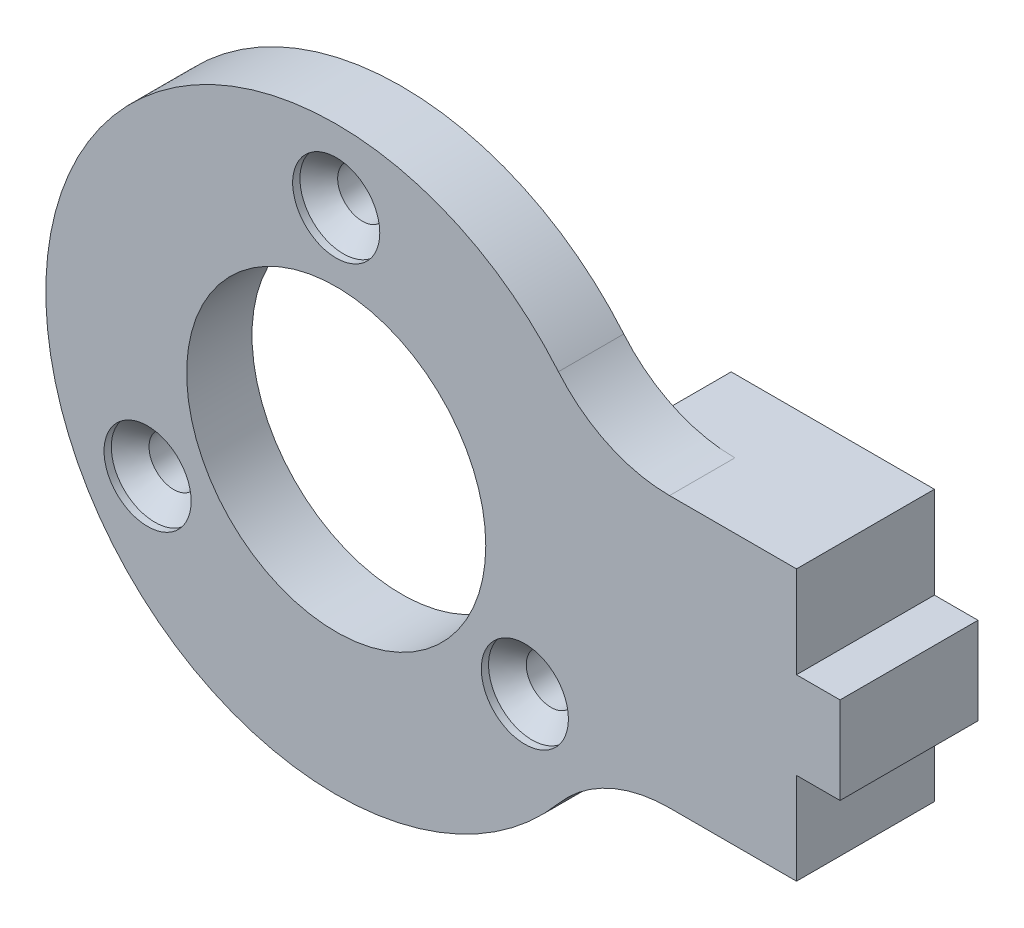
ISO-10303-21;
HEADER;
FILE_DESCRIPTION(('STEP AP214'),'2;1');
FILE_NAME('part.step','',(''),(''),'','','');
FILE_SCHEMA(('AUTOMOTIVE_DESIGN { 1 0 10303 214 1 1 1 1 }'));
ENDSEC;
DATA;
#1=APPLICATION_CONTEXT('core data for automotive mechanical design processes');
#2=APPLICATION_PROTOCOL_DEFINITION('international standard','automotive_design',2000,#1);
#3=PRODUCT_CONTEXT('',#1,'mechanical');
#4=PRODUCT('Part','Part','',(#3));
#5=PRODUCT_RELATED_PRODUCT_CATEGORY('part','',(#4));
#6=PRODUCT_DEFINITION_FORMATION('','',#4);
#7=PRODUCT_DEFINITION_CONTEXT('part definition',#1,'design');
#8=PRODUCT_DEFINITION('design','',#6,#7);
#9=PRODUCT_DEFINITION_SHAPE('','',#8);
#10=(LENGTH_UNIT() NAMED_UNIT(*) SI_UNIT(.MILLI.,.METRE.));
#11=(NAMED_UNIT(*) PLANE_ANGLE_UNIT() SI_UNIT($,.RADIAN.));
#12=(NAMED_UNIT(*) SI_UNIT($,.STERADIAN.) SOLID_ANGLE_UNIT());
#13=UNCERTAINTY_MEASURE_WITH_UNIT(LENGTH_MEASURE(1.E-05),#10,'distance_accuracy_value','');
#14=(GEOMETRIC_REPRESENTATION_CONTEXT(3) GLOBAL_UNCERTAINTY_ASSIGNED_CONTEXT((#13)) GLOBAL_UNIT_ASSIGNED_CONTEXT((#10,
#11,#12)) REPRESENTATION_CONTEXT('',''));
#15=CARTESIAN_POINT('',(0.,0.,0.));
#16=DIRECTION('',(0.,0.,1.));
#17=DIRECTION('',(1.,0.,0.));
#18=AXIS2_PLACEMENT_3D('',#15,#16,#17);
#19=CARTESIAN_POINT('',(0.,0.,0.));
#20=DIRECTION('',(0.,0.,1.));
#21=DIRECTION('',(1.,0.,0.));
#22=AXIS2_PLACEMENT_3D('',#19,#20,#21);
#23=PLANE('',#22);
#24=CARTESIAN_POINT('',(-12.9903810567665,-7.50000000000006,0.));
#25=DIRECTION('',(0.,0.,1.));
#26=DIRECTION('',(1.,0.,0.));
#27=AXIS2_PLACEMENT_3D('',#24,#25,#26);
#28=CIRCLE('',#27,1.7);
#29=CARTESIAN_POINT('',(-11.2903810567665,-7.50000000000006,0.));
#30=VERTEX_POINT('',#29);
#31=EDGE_CURVE('E186',#30,#30,#28,.T.);
#32=ORIENTED_EDGE('',*,*,#31,.T.);
#33=EDGE_LOOP('',(#32));
#34=FACE_BOUND('',#33,.T.);
#35=CARTESIAN_POINT('',(0.,15.,0.));
#36=DIRECTION('',(0.,0.,1.));
#37=DIRECTION('',(1.,0.,0.));
#38=AXIS2_PLACEMENT_3D('',#35,#36,#37);
#39=CIRCLE('',#38,1.7);
#40=CARTESIAN_POINT('',(1.7,15.,0.));
#41=VERTEX_POINT('',#40);
#42=EDGE_CURVE('E194',#41,#41,#39,.T.);
#43=ORIENTED_EDGE('',*,*,#42,.T.);
#44=EDGE_LOOP('',(#43));
#45=FACE_BOUND('',#44,.T.);
#46=CARTESIAN_POINT('',(12.9903810567666,-7.49999999999988,0.));
#47=DIRECTION('',(0.,0.,1.));
#48=DIRECTION('',(1.,0.,0.));
#49=AXIS2_PLACEMENT_3D('',#46,#47,#48);
#50=CIRCLE('',#49,1.7);
#51=CARTESIAN_POINT('',(14.6903810567666,-7.49999999999988,0.));
#52=VERTEX_POINT('',#51);
#53=EDGE_CURVE('E197',#52,#52,#50,.T.);
#54=ORIENTED_EDGE('',*,*,#53,.T.);
#55=EDGE_LOOP('',(#54));
#56=FACE_BOUND('',#55,.T.);
#57=CARTESIAN_POINT('',(0.,0.,0.));
#58=DIRECTION('',(0.,0.,1.));
#59=DIRECTION('',(1.,0.,0.));
#60=AXIS2_PLACEMENT_3D('',#57,#58,#59);
#61=CIRCLE('',#60,10.3);
#62=CARTESIAN_POINT('',(10.3,0.,0.));
#63=VERTEX_POINT('',#62);
#64=EDGE_CURVE('E200',#63,#63,#61,.T.);
#65=ORIENTED_EDGE('',*,*,#64,.T.);
#66=EDGE_LOOP('',(#65));
#67=FACE_BOUND('',#66,.T.);
#68=CARTESIAN_POINT('',(0.,0.,0.));
#69=DIRECTION('',(0.,0.,1.));
#70=DIRECTION('',(1.,0.,0.));
#71=AXIS2_PLACEMENT_3D('',#68,#69,#70);
#72=CIRCLE('',#71,20.);
#73=CARTESIAN_POINT('',(15.3033552020235,12.876619104435,0.));
#74=VERTEX_POINT('',#73);
#75=CARTESIAN_POINT('',(15.3033552020235,-12.876619104435,0.));
#76=VERTEX_POINT('',#75);
#77=EDGE_CURVE('E204',#74,#76,#72,.T.);
#78=ORIENTED_EDGE('',*,*,#77,.F.);
#79=CARTESIAN_POINT('',(22.9550328030353,19.3149286566524,0.));
#80=DIRECTION('',(0.,0.,1.));
#81=DIRECTION('',(1.,0.,0.));
#82=AXIS2_PLACEMENT_3D('',#79,#80,#81);
#83=CIRCLE('',#82,10.);
#84=CARTESIAN_POINT('',(22.9550328030353,9.31492865665245,0.));
#85=VERTEX_POINT('',#84);
#86=EDGE_CURVE('E41',#74,#85,#83,.T.);
#87=ORIENTED_EDGE('',*,*,#86,.T.);
#88=DIRECTION('',(1.,0.,0.));
#89=VECTOR('',#88,1.);
#90=CARTESIAN_POINT('',(0.,9.31492865665244,0.));
#91=LINE('',#90,#89);
#92=CARTESIAN_POINT('',(17.6983644476396,9.31492865665245,0.));
#93=VERTEX_POINT('',#92);
#94=EDGE_CURVE('E48',#93,#85,#91,.T.);
#95=ORIENTED_EDGE('',*,*,#94,.F.);
#96=CARTESIAN_POINT('',(0.,0.,0.));
#97=DIRECTION('',(0.,0.,-1.));
#98=DIRECTION('',(-1.,0.,0.));
#99=AXIS2_PLACEMENT_3D('',#96,#97,#98);
#100=CIRCLE('',#99,20.);
#101=CARTESIAN_POINT('',(17.6983644476396,-9.31492865665245,0.));
#102=VERTEX_POINT('',#101);
#103=EDGE_CURVE('E133',#93,#102,#100,.T.);
#104=ORIENTED_EDGE('',*,*,#103,.T.);
#105=DIRECTION('',(-1.,0.,0.));
#106=VECTOR('',#105,1.);
#107=CARTESIAN_POINT('',(0.,-9.31492865665244,0.));
#108=LINE('',#107,#106);
#109=CARTESIAN_POINT('',(22.9550328030353,-9.31492865665245,0.));
#110=VERTEX_POINT('',#109);
#111=EDGE_CURVE('E120',#110,#102,#108,.T.);
#112=ORIENTED_EDGE('',*,*,#111,.F.);
#113=CARTESIAN_POINT('',(22.9550328030353,-19.3149286566524,0.));
#114=DIRECTION('',(0.,0.,1.));
#115=DIRECTION('',(1.,0.,0.));
#116=AXIS2_PLACEMENT_3D('',#113,#114,#115);
#117=CIRCLE('',#116,10.);
#118=EDGE_CURVE('E251',#110,#76,#117,.T.);
#119=ORIENTED_EDGE('',*,*,#118,.T.);
#120=EDGE_LOOP('',(#78,#87,#95,#104,#112,#119));
#121=FACE_BOUND('',#120,.T.);
#122=ADVANCED_FACE('F33',(#34,#45,#56,#67,#121),#23,.F.);
#123=CARTESIAN_POINT('',(31.6983644476396,9.31492865665245,4.5));
#124=DIRECTION('',(-1.,0.,0.));
#125=DIRECTION('',(0.,0.,1.));
#126=AXIS2_PLACEMENT_3D('',#123,#124,#125);
#127=PLANE('',#126);
#128=DIRECTION('',(0.,0.,-1.));
#129=VECTOR('',#128,1.);
#130=CARTESIAN_POINT('',(31.6983644476396,-3.,0.));
#131=LINE('',#130,#129);
#132=CARTESIAN_POINT('',(31.6983644476396,-3.,4.5));
#133=VERTEX_POINT('',#132);
#134=CARTESIAN_POINT('',(31.6983644476396,-3.,-5.));
#135=VERTEX_POINT('',#134);
#136=EDGE_CURVE('E163',#133,#135,#131,.T.);
#137=ORIENTED_EDGE('',*,*,#136,.F.);
#138=DIRECTION('',(0.,1.,0.));
#139=VECTOR('',#138,1.);
#140=CARTESIAN_POINT('',(31.6983644476396,9.31492865665245,4.5));
#141=LINE('',#140,#139);
#142=CARTESIAN_POINT('',(31.6983644476396,-9.31492865665245,4.5));
#143=VERTEX_POINT('',#142);
#144=EDGE_CURVE('E213',#143,#133,#141,.T.);
#145=ORIENTED_EDGE('',*,*,#144,.F.);
#146=DIRECTION('',(0.,0.,-1.));
#147=VECTOR('',#146,1.);
#148=CARTESIAN_POINT('',(31.6983644476396,-9.31492865665245,4.5));
#149=LINE('',#148,#147);
#150=CARTESIAN_POINT('',(31.6983644476396,-9.31492865665245,-5.));
#151=VERTEX_POINT('',#150);
#152=EDGE_CURVE('E223',#143,#151,#149,.T.);
#153=ORIENTED_EDGE('',*,*,#152,.T.);
#154=DIRECTION('',(0.,-1.,0.));
#155=VECTOR('',#154,1.);
#156=CARTESIAN_POINT('',(31.6983644476396,-9.31492865665245,-5.));
#157=LINE('',#156,#155);
#158=EDGE_CURVE('E158',#135,#151,#157,.T.);
#159=ORIENTED_EDGE('',*,*,#158,.F.);
#160=EDGE_LOOP('',(#137,#145,#153,#159));
#161=FACE_BOUND('',#160,.T.);
#162=ADVANCED_FACE('F284',(#161),#127,.F.);
#163=DIRECTION('',(0.,0.,1.));
#164=VECTOR('',#163,1.);
#165=CARTESIAN_POINT('',(31.6983644476396,3.,4.5));
#166=LINE('',#165,#164);
#167=CARTESIAN_POINT('',(31.6983644476396,3.,-5.));
#168=VERTEX_POINT('',#167);
#169=CARTESIAN_POINT('',(31.6983644476396,3.,4.5));
#170=VERTEX_POINT('',#169);
#171=EDGE_CURVE('E168',#168,#170,#166,.T.);
#172=ORIENTED_EDGE('',*,*,#171,.F.);
#173=DIRECTION('',(0.,-1.,0.));
#174=VECTOR('',#173,1.);
#175=CARTESIAN_POINT('',(31.6983644476396,3.,-5.));
#176=LINE('',#175,#174);
#177=CARTESIAN_POINT('',(31.6983644476396,9.31492865665245,-5.));
#178=VERTEX_POINT('',#177);
#179=EDGE_CURVE('E143',#178,#168,#176,.T.);
#180=ORIENTED_EDGE('',*,*,#179,.F.);
#181=DIRECTION('',(0.,0.,-1.));
#182=VECTOR('',#181,1.);
#183=CARTESIAN_POINT('',(31.6983644476396,9.31492865665245,4.5));
#184=LINE('',#183,#182);
#185=CARTESIAN_POINT('',(31.6983644476396,9.31492865665245,4.5));
#186=VERTEX_POINT('',#185);
#187=EDGE_CURVE('E219',#186,#178,#184,.T.);
#188=ORIENTED_EDGE('',*,*,#187,.F.);
#189=EDGE_CURVE('E212',#170,#186,#141,.T.);
#190=ORIENTED_EDGE('',*,*,#189,.F.);
#191=EDGE_LOOP('',(#172,#180,#188,#190));
#192=FACE_BOUND('',#191,.T.);
#193=ADVANCED_FACE('F276',(#192),#127,.F.);
#194=CARTESIAN_POINT('',(12.9903810567666,-7.49999999999988,4.5));
#195=DIRECTION('',(0.,0.,-1.));
#196=DIRECTION('',(-1.,0.,0.));
#197=AXIS2_PLACEMENT_3D('',#194,#195,#196);
#198=CYLINDRICAL_SURFACE('',#197,1.7);
#199=CARTESIAN_POINT('',(12.9903810567666,-7.49999999999988,2.70000000000002));
#200=DIRECTION('',(0.,0.,1.));
#201=DIRECTION('',(1.,0.,0.));
#202=AXIS2_PLACEMENT_3D('',#199,#200,#201);
#203=CIRCLE('',#202,1.7);
#204=CARTESIAN_POINT('',(14.6903810567666,-7.49999999999988,2.70000000000002));
#205=VERTEX_POINT('',#204);
#206=EDGE_CURVE('E234',#205,#205,#203,.T.);
#207=ORIENTED_EDGE('',*,*,#206,.T.);
#208=EDGE_LOOP('',(#207));
#209=FACE_BOUND('',#208,.T.);
#210=ORIENTED_EDGE('',*,*,#53,.F.);
#211=EDGE_LOOP('',(#210));
#212=FACE_BOUND('',#211,.T.);
#213=ADVANCED_FACE('F370',(#209,#212),#198,.F.);
#214=CARTESIAN_POINT('',(0.,15.,4.5));
#215=DIRECTION('',(0.,0.,-1.));
#216=DIRECTION('',(-1.,0.,0.));
#217=AXIS2_PLACEMENT_3D('',#214,#215,#216);
#218=CYLINDRICAL_SURFACE('',#217,1.7);
#219=CARTESIAN_POINT('',(0.,15.,2.70000000000002));
#220=DIRECTION('',(0.,0.,1.));
#221=DIRECTION('',(1.,0.,0.));
#222=AXIS2_PLACEMENT_3D('',#219,#220,#221);
#223=CIRCLE('',#222,1.7);
#224=CARTESIAN_POINT('',(1.7,15.,2.70000000000002));
#225=VERTEX_POINT('',#224);
#226=EDGE_CURVE('E237',#225,#225,#223,.T.);
#227=ORIENTED_EDGE('',*,*,#226,.T.);
#228=EDGE_LOOP('',(#227));
#229=FACE_BOUND('',#228,.T.);
#230=ORIENTED_EDGE('',*,*,#42,.F.);
#231=EDGE_LOOP('',(#230));
#232=FACE_BOUND('',#231,.T.);
#233=ADVANCED_FACE('F439',(#229,#232),#218,.F.);
#234=CARTESIAN_POINT('',(-12.9903810567665,-7.50000000000006,4.5));
#235=DIRECTION('',(0.,0.,-1.));
#236=DIRECTION('',(-1.,0.,0.));
#237=AXIS2_PLACEMENT_3D('',#234,#235,#236);
#238=CYLINDRICAL_SURFACE('',#237,1.7);
#239=CARTESIAN_POINT('',(-12.9903810567665,-7.50000000000006,2.70000000000002));
#240=DIRECTION('',(0.,0.,1.));
#241=DIRECTION('',(1.,0.,0.));
#242=AXIS2_PLACEMENT_3D('',#239,#240,#241);
#243=CIRCLE('',#242,1.7);
#244=CARTESIAN_POINT('',(-11.2903810567665,-7.50000000000006,2.70000000000002));
#245=VERTEX_POINT('',#244);
#246=EDGE_CURVE('E128',#245,#245,#243,.T.);
#247=ORIENTED_EDGE('',*,*,#246,.T.);
#248=EDGE_LOOP('',(#247));
#249=FACE_BOUND('',#248,.T.);
#250=ORIENTED_EDGE('',*,*,#31,.F.);
#251=EDGE_LOOP('',(#250));
#252=FACE_BOUND('',#251,.T.);
#253=ADVANCED_FACE('F434',(#249,#252),#238,.F.);
#254=CARTESIAN_POINT('',(0.,0.,4.5));
#255=DIRECTION('',(0.,0.,1.));
#256=DIRECTION('',(1.,0.,0.));
#257=AXIS2_PLACEMENT_3D('',#254,#255,#256);
#258=PLANE('',#257);
#259=CARTESIAN_POINT('',(0.,15.,4.5));
#260=DIRECTION('',(0.,0.,1.));
#261=DIRECTION('',(1.,0.,0.));
#262=AXIS2_PLACEMENT_3D('',#259,#260,#261);
#263=CIRCLE('',#262,3.);
#264=CARTESIAN_POINT('',(3.,15.,4.5));
#265=VERTEX_POINT('',#264);
#266=EDGE_CURVE('E183',#265,#265,#263,.T.);
#267=ORIENTED_EDGE('',*,*,#266,.F.);
#268=EDGE_LOOP('',(#267));
#269=FACE_BOUND('',#268,.T.);
#270=CARTESIAN_POINT('',(12.9903810567666,-7.49999999999988,4.5));
#271=DIRECTION('',(0.,0.,1.));
#272=DIRECTION('',(1.,0.,0.));
#273=AXIS2_PLACEMENT_3D('',#270,#271,#272);
#274=CIRCLE('',#273,3.);
#275=CARTESIAN_POINT('',(15.9903810567667,-7.49999999999988,4.5));
#276=VERTEX_POINT('',#275);
#277=EDGE_CURVE('E187',#276,#276,#274,.T.);
#278=ORIENTED_EDGE('',*,*,#277,.F.);
#279=EDGE_LOOP('',(#278));
#280=FACE_BOUND('',#279,.T.);
#281=CARTESIAN_POINT('',(-12.9903810567665,-7.50000000000006,4.5));
#282=DIRECTION('',(0.,0.,1.));
#283=DIRECTION('',(1.,0.,0.));
#284=AXIS2_PLACEMENT_3D('',#281,#282,#283);
#285=CIRCLE('',#284,3.);
#286=CARTESIAN_POINT('',(-9.99038105676654,-7.50000000000006,4.5));
#287=VERTEX_POINT('',#286);
#288=EDGE_CURVE('E182',#287,#287,#285,.T.);
#289=ORIENTED_EDGE('',*,*,#288,.F.);
#290=EDGE_LOOP('',(#289));
#291=FACE_BOUND('',#290,.T.);
#292=CARTESIAN_POINT('',(0.,0.,4.5));
#293=DIRECTION('',(0.,0.,1.));
#294=DIRECTION('',(1.,0.,0.));
#295=AXIS2_PLACEMENT_3D('',#292,#293,#294);
#296=CIRCLE('',#295,10.3);
#297=CARTESIAN_POINT('',(10.3,0.,4.5));
#298=VERTEX_POINT('',#297);
#299=EDGE_CURVE('E201',#298,#298,#296,.T.);
#300=ORIENTED_EDGE('',*,*,#299,.F.);
#301=EDGE_LOOP('',(#300));
#302=FACE_BOUND('',#301,.T.);
#303=DIRECTION('',(-1.,0.,0.));
#304=VECTOR('',#303,1.);
#305=CARTESIAN_POINT('',(17.6983644476396,9.31492865665245,4.5));
#306=LINE('',#305,#304);
#307=CARTESIAN_POINT('',(22.9550328030353,9.31492865665245,4.5));
#308=VERTEX_POINT('',#307);
#309=EDGE_CURVE('E216',#186,#308,#306,.T.);
#310=ORIENTED_EDGE('',*,*,#309,.T.);
#311=CARTESIAN_POINT('',(22.9550328030353,19.3149286566524,4.5));
#312=DIRECTION('',(0.,0.,1.));
#313=DIRECTION('',(1.,0.,0.));
#314=AXIS2_PLACEMENT_3D('',#311,#312,#313);
#315=CIRCLE('',#314,10.);
#316=CARTESIAN_POINT('',(15.3033552020235,12.876619104435,4.5));
#317=VERTEX_POINT('',#316);
#318=EDGE_CURVE('E11',#308,#317,#315,.F.);
#319=ORIENTED_EDGE('',*,*,#318,.T.);
#320=CARTESIAN_POINT('',(0.,0.,4.5));
#321=DIRECTION('',(0.,0.,1.));
#322=DIRECTION('',(1.,0.,0.));
#323=AXIS2_PLACEMENT_3D('',#320,#321,#322);
#324=CIRCLE('',#323,20.);
#325=CARTESIAN_POINT('',(15.3033552020235,-12.876619104435,4.5));
#326=VERTEX_POINT('',#325);
#327=EDGE_CURVE('E207',#317,#326,#324,.T.);
#328=ORIENTED_EDGE('',*,*,#327,.T.);
#329=CARTESIAN_POINT('',(22.9550328030353,-19.3149286566524,4.5));
#330=DIRECTION('',(0.,0.,1.));
#331=DIRECTION('',(1.,0.,0.));
#332=AXIS2_PLACEMENT_3D('',#329,#330,#331);
#333=CIRCLE('',#332,10.);
#334=CARTESIAN_POINT('',(22.9550328030353,-9.31492865665245,4.5));
#335=VERTEX_POINT('',#334);
#336=EDGE_CURVE('E253',#326,#335,#333,.F.);
#337=ORIENTED_EDGE('',*,*,#336,.T.);
#338=DIRECTION('',(1.,0.,0.));
#339=VECTOR('',#338,1.);
#340=CARTESIAN_POINT('',(17.6983644476396,-9.31492865665245,4.5));
#341=LINE('',#340,#339);
#342=EDGE_CURVE('E210',#335,#143,#341,.T.);
#343=ORIENTED_EDGE('',*,*,#342,.T.);
#344=ORIENTED_EDGE('',*,*,#144,.T.);
#345=DIRECTION('',(-1.,0.,0.));
#346=VECTOR('',#345,1.);
#347=CARTESIAN_POINT('',(34.6983644476396,-3.,4.5));
#348=LINE('',#347,#346);
#349=CARTESIAN_POINT('',(34.6983644476396,-3.,4.5));
#350=VERTEX_POINT('',#349);
#351=EDGE_CURVE('E179',#350,#133,#348,.T.);
#352=ORIENTED_EDGE('',*,*,#351,.F.);
#353=DIRECTION('',(0.,-1.,0.));
#354=VECTOR('',#353,1.);
#355=CARTESIAN_POINT('',(34.6983644476396,-3.,4.5));
#356=LINE('',#355,#354);
#357=CARTESIAN_POINT('',(34.6983644476396,3.,4.5));
#358=VERTEX_POINT('',#357);
#359=EDGE_CURVE('E164',#358,#350,#356,.T.);
#360=ORIENTED_EDGE('',*,*,#359,.F.);
#361=DIRECTION('',(-1.,0.,0.));
#362=VECTOR('',#361,1.);
#363=CARTESIAN_POINT('',(34.6983644476396,3.,4.5));
#364=LINE('',#363,#362);
#365=EDGE_CURVE('E173',#358,#170,#364,.T.);
#366=ORIENTED_EDGE('',*,*,#365,.T.);
#367=ORIENTED_EDGE('',*,*,#189,.T.);
#368=EDGE_LOOP('',(#310,#319,#328,#337,#343,#344,#352,#360,#366,#367));
#369=FACE_BOUND('',#368,.T.);
#370=ADVANCED_FACE('F256',(#269,#280,#291,#302,#369),#258,.T.);
#371=CARTESIAN_POINT('',(0.,0.,4.5));
#372=DIRECTION('',(0.,0.,-1.));
#373=DIRECTION('',(-1.,0.,0.));
#374=AXIS2_PLACEMENT_3D('',#371,#372,#373);
#375=CYLINDRICAL_SURFACE('',#374,20.);
#376=ORIENTED_EDGE('',*,*,#77,.T.);
#377=DIRECTION('',(0.,0.,-1.));
#378=VECTOR('',#377,1.);
#379=CARTESIAN_POINT('',(15.3033552020235,-12.876619104435,4.5));
#380=LINE('',#379,#378);
#381=EDGE_CURVE('E246',#76,#326,#380,.F.);
#382=ORIENTED_EDGE('',*,*,#381,.T.);
#383=ORIENTED_EDGE('',*,*,#327,.F.);
#384=DIRECTION('',(0.,0.,-1.));
#385=VECTOR('',#384,1.);
#386=CARTESIAN_POINT('',(15.3033552020235,12.876619104435,4.5));
#387=LINE('',#386,#385);
#388=EDGE_CURVE('E243',#317,#74,#387,.T.);
#389=ORIENTED_EDGE('',*,*,#388,.T.);
#390=EDGE_LOOP('',(#376,#382,#383,#389));
#391=FACE_BOUND('',#390,.T.);
#392=ADVANCED_FACE('F264',(#391),#375,.T.);
#393=CARTESIAN_POINT('',(17.6983644476396,-9.31492865665245,4.5));
#394=DIRECTION('',(0.,1.,0.));
#395=DIRECTION('',(-1.,0.,0.));
#396=AXIS2_PLACEMENT_3D('',#393,#394,#395);
#397=PLANE('',#396);
#398=ORIENTED_EDGE('',*,*,#342,.F.);
#399=DIRECTION('',(0.,0.,1.));
#400=VECTOR('',#399,1.);
#401=CARTESIAN_POINT('',(22.9550328030353,-9.31492865665245,0.));
#402=LINE('',#401,#400);
#403=EDGE_CURVE('E127',#335,#110,#402,.F.);
#404=ORIENTED_EDGE('',*,*,#403,.T.);
#405=ORIENTED_EDGE('',*,*,#111,.T.);
#406=DIRECTION('',(0.,0.,1.));
#407=VECTOR('',#406,1.);
#408=CARTESIAN_POINT('',(17.6983644476396,-9.31492865665245,-5.));
#409=LINE('',#408,#407);
#410=CARTESIAN_POINT('',(17.6983644476396,-9.31492865665245,-5.));
#411=VERTEX_POINT('',#410);
#412=EDGE_CURVE('E125',#411,#102,#409,.T.);
#413=ORIENTED_EDGE('',*,*,#412,.F.);
#414=DIRECTION('',(-1.,0.,0.));
#415=VECTOR('',#414,1.);
#416=CARTESIAN_POINT('',(17.6983644476396,-9.31492865665245,-5.));
#417=LINE('',#416,#415);
#418=EDGE_CURVE('E138',#151,#411,#417,.T.);
#419=ORIENTED_EDGE('',*,*,#418,.F.);
#420=ORIENTED_EDGE('',*,*,#152,.F.);
#421=EDGE_LOOP('',(#398,#404,#405,#413,#419,#420));
#422=FACE_BOUND('',#421,.T.);
#423=ADVANCED_FACE('F123',(#422),#397,.F.);
#424=CARTESIAN_POINT('',(17.6983644476396,9.31492865665245,4.5));
#425=DIRECTION('',(0.,-1.,0.));
#426=DIRECTION('',(1.,0.,0.));
#427=AXIS2_PLACEMENT_3D('',#424,#425,#426);
#428=PLANE('',#427);
#429=DIRECTION('',(0.,0.,1.));
#430=VECTOR('',#429,1.);
#431=CARTESIAN_POINT('',(17.6983644476396,9.31492865665245,-5.));
#432=LINE('',#431,#430);
#433=CARTESIAN_POINT('',(17.6983644476396,9.31492865665245,-5.));
#434=VERTEX_POINT('',#433);
#435=EDGE_CURVE('E137',#434,#93,#432,.T.);
#436=ORIENTED_EDGE('',*,*,#435,.T.);
#437=ORIENTED_EDGE('',*,*,#94,.T.);
#438=DIRECTION('',(0.,0.,1.));
#439=VECTOR('',#438,1.);
#440=CARTESIAN_POINT('',(22.9550328030353,9.31492865665245,4.5));
#441=LINE('',#440,#439);
#442=EDGE_CURVE('E248',#85,#308,#441,.T.);
#443=ORIENTED_EDGE('',*,*,#442,.T.);
#444=ORIENTED_EDGE('',*,*,#309,.F.);
#445=ORIENTED_EDGE('',*,*,#187,.T.);
#446=DIRECTION('',(1.,0.,0.));
#447=VECTOR('',#446,1.);
#448=CARTESIAN_POINT('',(31.6983644476396,9.31492865665245,-5.));
#449=LINE('',#448,#447);
#450=EDGE_CURVE('E140',#434,#178,#449,.T.);
#451=ORIENTED_EDGE('',*,*,#450,.F.);
#452=EDGE_LOOP('',(#436,#437,#443,#444,#445,#451));
#453=FACE_BOUND('',#452,.T.);
#454=ADVANCED_FACE('F271',(#453),#428,.F.);
#455=CARTESIAN_POINT('',(0.,0.,4.5));
#456=DIRECTION('',(0.,0.,-1.));
#457=DIRECTION('',(-1.,0.,0.));
#458=AXIS2_PLACEMENT_3D('',#455,#456,#457);
#459=CYLINDRICAL_SURFACE('',#458,10.3);
#460=ORIENTED_EDGE('',*,*,#299,.T.);
#461=EDGE_LOOP('',(#460));
#462=FACE_BOUND('',#461,.T.);
#463=ORIENTED_EDGE('',*,*,#64,.F.);
#464=EDGE_LOOP('',(#463));
#465=FACE_BOUND('',#464,.T.);
#466=ADVANCED_FACE('F314',(#462,#465),#459,.F.);
#467=CARTESIAN_POINT('',(-12.9903810567665,-7.50000000000006,2.5));
#468=DIRECTION('',(0.,0.,1.));
#469=DIRECTION('',(1.,0.,0.));
#470=AXIS2_PLACEMENT_3D('',#467,#468,#469);
#471=CYLINDRICAL_SURFACE('',#470,3.);
#472=CARTESIAN_POINT('',(-12.9903810567665,-7.50000000000006,4.00000000000001));
#473=DIRECTION('',(0.,0.,1.));
#474=DIRECTION('',(1.,0.,0.));
#475=AXIS2_PLACEMENT_3D('',#472,#473,#474);
#476=CIRCLE('',#475,3.);
#477=CARTESIAN_POINT('',(-9.99038105676654,-7.50000000000006,4.00000000000001));
#478=VERTEX_POINT('',#477);
#479=EDGE_CURVE('E231',#478,#478,#476,.F.);
#480=ORIENTED_EDGE('',*,*,#479,.T.);
#481=EDGE_LOOP('',(#480));
#482=FACE_BOUND('',#481,.T.);
#483=ORIENTED_EDGE('',*,*,#288,.T.);
#484=EDGE_LOOP('',(#483));
#485=FACE_BOUND('',#484,.T.);
#486=ADVANCED_FACE('F417',(#482,#485),#471,.F.);
#487=CARTESIAN_POINT('',(0.,15.,2.5));
#488=DIRECTION('',(0.,0.,1.));
#489=DIRECTION('',(1.,0.,0.));
#490=AXIS2_PLACEMENT_3D('',#487,#488,#489);
#491=CYLINDRICAL_SURFACE('',#490,3.);
#492=CARTESIAN_POINT('',(0.,15.,4.00000000000001));
#493=DIRECTION('',(0.,0.,1.));
#494=DIRECTION('',(1.,0.,0.));
#495=AXIS2_PLACEMENT_3D('',#492,#493,#494);
#496=CIRCLE('',#495,3.);
#497=CARTESIAN_POINT('',(3.,15.,4.00000000000001));
#498=VERTEX_POINT('',#497);
#499=EDGE_CURVE('E228',#498,#498,#496,.F.);
#500=ORIENTED_EDGE('',*,*,#499,.T.);
#501=EDGE_LOOP('',(#500));
#502=FACE_BOUND('',#501,.T.);
#503=ORIENTED_EDGE('',*,*,#266,.T.);
#504=EDGE_LOOP('',(#503));
#505=FACE_BOUND('',#504,.T.);
#506=ADVANCED_FACE('F407',(#502,#505),#491,.F.);
#507=CARTESIAN_POINT('',(12.9903810567666,-7.49999999999988,2.5));
#508=DIRECTION('',(0.,0.,1.));
#509=DIRECTION('',(1.,0.,0.));
#510=AXIS2_PLACEMENT_3D('',#507,#508,#509);
#511=CYLINDRICAL_SURFACE('',#510,3.);
#512=CARTESIAN_POINT('',(12.9903810567666,-7.49999999999988,4.00000000000001));
#513=DIRECTION('',(0.,0.,1.));
#514=DIRECTION('',(1.,0.,0.));
#515=AXIS2_PLACEMENT_3D('',#512,#513,#514);
#516=CIRCLE('',#515,3.);
#517=CARTESIAN_POINT('',(15.9903810567667,-7.49999999999988,4.00000000000001));
#518=VERTEX_POINT('',#517);
#519=EDGE_CURVE('E225',#518,#518,#516,.F.);
#520=ORIENTED_EDGE('',*,*,#519,.T.);
#521=EDGE_LOOP('',(#520));
#522=FACE_BOUND('',#521,.T.);
#523=ORIENTED_EDGE('',*,*,#277,.T.);
#524=EDGE_LOOP('',(#523));
#525=FACE_BOUND('',#524,.T.);
#526=ADVANCED_FACE('F324',(#522,#525),#511,.F.);
#527=CARTESIAN_POINT('',(12.9903810567666,-7.49999999999988,2.5));
#528=DIRECTION('',(0.,0.,1.));
#529=DIRECTION('',(1.,0.,0.));
#530=AXIS2_PLACEMENT_3D('',#527,#528,#529);
#531=CONICAL_SURFACE('',#530,1.49999999999998,0.785398163397453);
#532=ORIENTED_EDGE('',*,*,#519,.F.);
#533=EDGE_LOOP('',(#532));
#534=FACE_BOUND('',#533,.T.);
#535=ORIENTED_EDGE('',*,*,#206,.F.);
#536=EDGE_LOOP('',(#535));
#537=FACE_BOUND('',#536,.T.);
#538=ADVANCED_FACE('F320',(#534,#537),#531,.F.);
#539=CARTESIAN_POINT('',(0.,15.,2.5));
#540=DIRECTION('',(0.,0.,1.));
#541=DIRECTION('',(1.,0.,0.));
#542=AXIS2_PLACEMENT_3D('',#539,#540,#541);
#543=CONICAL_SURFACE('',#542,1.49999999999997,0.785398163397453);
#544=ORIENTED_EDGE('',*,*,#499,.F.);
#545=EDGE_LOOP('',(#544));
#546=FACE_BOUND('',#545,.T.);
#547=ORIENTED_EDGE('',*,*,#226,.F.);
#548=EDGE_LOOP('',(#547));
#549=FACE_BOUND('',#548,.T.);
#550=ADVANCED_FACE('F323',(#546,#549),#543,.F.);
#551=CARTESIAN_POINT('',(-12.9903810567665,-7.50000000000006,2.5));
#552=DIRECTION('',(0.,0.,1.));
#553=DIRECTION('',(1.,0.,0.));
#554=AXIS2_PLACEMENT_3D('',#551,#552,#553);
#555=CONICAL_SURFACE('',#554,1.49999999999998,0.785398163397453);
#556=ORIENTED_EDGE('',*,*,#479,.F.);
#557=EDGE_LOOP('',(#556));
#558=FACE_BOUND('',#557,.T.);
#559=ORIENTED_EDGE('',*,*,#246,.F.);
#560=EDGE_LOOP('',(#559));
#561=FACE_BOUND('',#560,.T.);
#562=ADVANCED_FACE('F300',(#558,#561),#555,.F.);
#563=CARTESIAN_POINT('',(34.6983644476396,-3.,0.));
#564=DIRECTION('',(0.,1.,0.));
#565=DIRECTION('',(-1.,0.,0.));
#566=AXIS2_PLACEMENT_3D('',#563,#564,#565);
#567=PLANE('',#566);
#568=ORIENTED_EDGE('',*,*,#136,.T.);
#569=DIRECTION('',(-1.,0.,0.));
#570=VECTOR('',#569,1.);
#571=CARTESIAN_POINT('',(31.6983644476396,-3.,-5.));
#572=LINE('',#571,#570);
#573=CARTESIAN_POINT('',(34.6983644476396,-3.,-5.));
#574=VERTEX_POINT('',#573);
#575=EDGE_CURVE('E155',#574,#135,#572,.T.);
#576=ORIENTED_EDGE('',*,*,#575,.F.);
#577=DIRECTION('',(0.,0.,-1.));
#578=VECTOR('',#577,1.);
#579=CARTESIAN_POINT('',(34.6983644476396,-3.,0.));
#580=LINE('',#579,#578);
#581=EDGE_CURVE('E167',#350,#574,#580,.T.);
#582=ORIENTED_EDGE('',*,*,#581,.F.);
#583=ORIENTED_EDGE('',*,*,#351,.T.);
#584=EDGE_LOOP('',(#568,#576,#582,#583));
#585=FACE_BOUND('',#584,.T.);
#586=ADVANCED_FACE('F287',(#585),#567,.F.);
#587=CARTESIAN_POINT('',(34.6983644476396,3.,4.5));
#588=DIRECTION('',(0.,-1.,0.));
#589=DIRECTION('',(1.,0.,0.));
#590=AXIS2_PLACEMENT_3D('',#587,#588,#589);
#591=PLANE('',#590);
#592=ORIENTED_EDGE('',*,*,#171,.T.);
#593=ORIENTED_EDGE('',*,*,#365,.F.);
#594=DIRECTION('',(0.,0.,1.));
#595=VECTOR('',#594,1.);
#596=CARTESIAN_POINT('',(34.6983644476396,3.,4.5));
#597=LINE('',#596,#595);
#598=CARTESIAN_POINT('',(34.6983644476396,3.,-5.));
#599=VERTEX_POINT('',#598);
#600=EDGE_CURVE('E170',#599,#358,#597,.T.);
#601=ORIENTED_EDGE('',*,*,#600,.F.);
#602=DIRECTION('',(1.,0.,0.));
#603=VECTOR('',#602,1.);
#604=CARTESIAN_POINT('',(34.6983644476396,3.,-5.));
#605=LINE('',#604,#603);
#606=EDGE_CURVE('E149',#168,#599,#605,.T.);
#607=ORIENTED_EDGE('',*,*,#606,.F.);
#608=EDGE_LOOP('',(#592,#593,#601,#607));
#609=FACE_BOUND('',#608,.T.);
#610=ADVANCED_FACE('F292',(#609),#591,.F.);
#611=CARTESIAN_POINT('',(34.6983644476396,0.,0.));
#612=DIRECTION('',(-1.,0.,0.));
#613=DIRECTION('',(0.,0.,1.));
#614=AXIS2_PLACEMENT_3D('',#611,#612,#613);
#615=PLANE('',#614);
#616=ORIENTED_EDGE('',*,*,#359,.T.);
#617=ORIENTED_EDGE('',*,*,#581,.T.);
#618=DIRECTION('',(0.,-1.,0.));
#619=VECTOR('',#618,1.);
#620=CARTESIAN_POINT('',(34.6983644476396,-3.,-5.));
#621=LINE('',#620,#619);
#622=EDGE_CURVE('E152',#599,#574,#621,.T.);
#623=ORIENTED_EDGE('',*,*,#622,.F.);
#624=ORIENTED_EDGE('',*,*,#600,.T.);
#625=EDGE_LOOP('',(#616,#617,#623,#624));
#626=FACE_BOUND('',#625,.T.);
#627=ADVANCED_FACE('F290',(#626),#615,.F.);
#628=CARTESIAN_POINT('',(0.,0.,-5.));
#629=DIRECTION('',(0.,0.,1.));
#630=DIRECTION('',(1.,0.,0.));
#631=AXIS2_PLACEMENT_3D('',#628,#629,#630);
#632=PLANE('',#631);
#633=ORIENTED_EDGE('',*,*,#418,.T.);
#634=CARTESIAN_POINT('',(0.,0.,-5.));
#635=DIRECTION('',(0.,0.,-1.));
#636=DIRECTION('',(-1.,0.,0.));
#637=AXIS2_PLACEMENT_3D('',#634,#635,#636);
#638=CIRCLE('',#637,20.);
#639=EDGE_CURVE('E135',#434,#411,#638,.T.);
#640=ORIENTED_EDGE('',*,*,#639,.F.);
#641=ORIENTED_EDGE('',*,*,#450,.T.);
#642=ORIENTED_EDGE('',*,*,#179,.T.);
#643=ORIENTED_EDGE('',*,*,#606,.T.);
#644=ORIENTED_EDGE('',*,*,#622,.T.);
#645=ORIENTED_EDGE('',*,*,#575,.T.);
#646=ORIENTED_EDGE('',*,*,#158,.T.);
#647=EDGE_LOOP('',(#633,#640,#641,#642,#643,#644,#645,#646));
#648=FACE_BOUND('',#647,.T.);
#649=ADVANCED_FACE('F279',(#648),#632,.F.);
#650=CARTESIAN_POINT('',(0.,0.,0.));
#651=DIRECTION('',(0.,0.,-1.));
#652=DIRECTION('',(-1.,0.,0.));
#653=AXIS2_PLACEMENT_3D('',#650,#651,#652);
#654=CYLINDRICAL_SURFACE('',#653,20.);
#655=ORIENTED_EDGE('',*,*,#103,.F.);
#656=ORIENTED_EDGE('',*,*,#435,.F.);
#657=ORIENTED_EDGE('',*,*,#639,.T.);
#658=ORIENTED_EDGE('',*,*,#412,.T.);
#659=EDGE_LOOP('',(#655,#656,#657,#658));
#660=FACE_BOUND('',#659,.T.);
#661=ADVANCED_FACE('F132',(#660),#654,.F.);
#662=CARTESIAN_POINT('',(22.9550328030353,-19.3149286566524,4.5));
#663=DIRECTION('',(0.,0.,-1.));
#664=DIRECTION('',(-1.,0.,0.));
#665=AXIS2_PLACEMENT_3D('',#662,#663,#664);
#666=CYLINDRICAL_SURFACE('',#665,10.);
#667=ORIENTED_EDGE('',*,*,#336,.F.);
#668=ORIENTED_EDGE('',*,*,#381,.F.);
#669=ORIENTED_EDGE('',*,*,#118,.F.);
#670=ORIENTED_EDGE('',*,*,#403,.F.);
#671=EDGE_LOOP('',(#667,#668,#669,#670));
#672=FACE_BOUND('',#671,.T.);
#673=ADVANCED_FACE('F262',(#672),#666,.F.);
#674=CARTESIAN_POINT('',(22.9550328030353,19.3149286566524,4.5));
#675=DIRECTION('',(0.,0.,-1.));
#676=DIRECTION('',(-1.,0.,0.));
#677=AXIS2_PLACEMENT_3D('',#674,#675,#676);
#678=CYLINDRICAL_SURFACE('',#677,10.);
#679=ORIENTED_EDGE('',*,*,#318,.F.);
#680=ORIENTED_EDGE('',*,*,#442,.F.);
#681=ORIENTED_EDGE('',*,*,#86,.F.);
#682=ORIENTED_EDGE('',*,*,#388,.F.);
#683=EDGE_LOOP('',(#679,#680,#681,#682));
#684=FACE_BOUND('',#683,.T.);
#685=ADVANCED_FACE('F35',(#684),#678,.F.);
#686=CLOSED_SHELL('',(#122,#162,#193,#213,#233,#253,#370,#392,#423,#454,#466,#486,#506,#526,
#538,#550,#562,#586,#610,#627,#649,#661,#673,#685));
#687=MANIFOLD_SOLID_BREP('B2',#686);
#688=ADVANCED_BREP_SHAPE_REPRESENTATION('',(#18,#687),#14);
#689=SHAPE_DEFINITION_REPRESENTATION(#9,#688);
ENDSEC;
END-ISO-10303-21;
